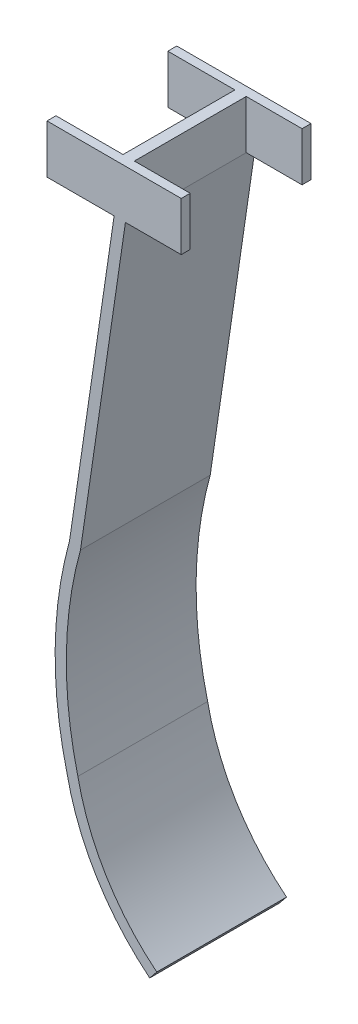
ISO-10303-21;
HEADER;
FILE_DESCRIPTION(('STEP AP214'),'2;1');
FILE_NAME('part.step','',(''),(''),'','','');
FILE_SCHEMA(('AUTOMOTIVE_DESIGN { 1 0 10303 214 1 1 1 1 }'));
ENDSEC;
DATA;
#1=APPLICATION_CONTEXT('core data for automotive mechanical design processes');
#2=APPLICATION_PROTOCOL_DEFINITION('international standard','automotive_design',2000,#1);
#3=PRODUCT_CONTEXT('',#1,'mechanical');
#4=PRODUCT('Part','Part','',(#3));
#5=PRODUCT_RELATED_PRODUCT_CATEGORY('part','',(#4));
#6=PRODUCT_DEFINITION_FORMATION('','',#4);
#7=PRODUCT_DEFINITION_CONTEXT('part definition',#1,'design');
#8=PRODUCT_DEFINITION('design','',#6,#7);
#9=PRODUCT_DEFINITION_SHAPE('','',#8);
#10=(LENGTH_UNIT() NAMED_UNIT(*) SI_UNIT(.MILLI.,.METRE.));
#11=(NAMED_UNIT(*) PLANE_ANGLE_UNIT() SI_UNIT($,.RADIAN.));
#12=(NAMED_UNIT(*) SI_UNIT($,.STERADIAN.) SOLID_ANGLE_UNIT());
#13=UNCERTAINTY_MEASURE_WITH_UNIT(LENGTH_MEASURE(1.E-05),#10,'distance_accuracy_value','');
#14=(GEOMETRIC_REPRESENTATION_CONTEXT(3) GLOBAL_UNCERTAINTY_ASSIGNED_CONTEXT((#13)) GLOBAL_UNIT_ASSIGNED_CONTEXT((#10,
#11,#12)) REPRESENTATION_CONTEXT('',''));
#15=CARTESIAN_POINT('',(0.,0.,0.));
#16=DIRECTION('',(0.,0.,1.));
#17=DIRECTION('',(1.,0.,0.));
#18=AXIS2_PLACEMENT_3D('',#15,#16,#17);
#19=CARTESIAN_POINT('',(0.,45.7887493873009,14.5));
#20=DIRECTION('',(0.,1.,0.));
#21=DIRECTION('',(0.,0.,1.));
#22=AXIS2_PLACEMENT_3D('',#19,#20,#21);
#23=PLANE('',#22);
#24=DIRECTION('',(0.,0.,-1.));
#25=VECTOR('',#24,1.);
#26=CARTESIAN_POINT('',(-30.3032531105134,45.7887493873009,14.5));
#27=LINE('',#26,#25);
#28=CARTESIAN_POINT('',(-30.3032531105134,45.7887493873009,1.));
#29=VERTEX_POINT('',#28);
#30=CARTESIAN_POINT('',(-30.3032531105134,45.7887493873009,0.));
#31=VERTEX_POINT('',#30);
#32=EDGE_CURVE('E198',#29,#31,#27,.T.);
#33=ORIENTED_EDGE('',*,*,#32,.F.);
#34=DIRECTION('',(1.,0.,0.));
#35=VECTOR('',#34,1.);
#36=CARTESIAN_POINT('',(-30.3032531105134,45.7887493873009,1.));
#37=LINE('',#36,#35);
#38=CARTESIAN_POINT('',(-36.5398548495292,45.7887493873009,0.999999999999999));
#39=VERTEX_POINT('',#38);
#40=EDGE_CURVE('E183',#39,#29,#37,.T.);
#41=ORIENTED_EDGE('',*,*,#40,.F.);
#42=DIRECTION('',(0.,0.,-1.));
#43=VECTOR('',#42,1.);
#44=CARTESIAN_POINT('',(-36.5398548495292,45.7887493873009,14.5));
#45=LINE('',#44,#43);
#46=CARTESIAN_POINT('',(-36.5398548495292,45.7887493873009,0.));
#47=VERTEX_POINT('',#46);
#48=EDGE_CURVE('E197',#39,#47,#45,.T.);
#49=ORIENTED_EDGE('',*,*,#48,.T.);
#50=DIRECTION('',(1.,0.,0.));
#51=VECTOR('',#50,1.);
#52=CARTESIAN_POINT('',(0.,45.7887493873009,0.));
#53=LINE('',#52,#51);
#54=EDGE_CURVE('E266',#47,#31,#53,.T.);
#55=ORIENTED_EDGE('',*,*,#54,.T.);
#56=EDGE_LOOP('',(#33,#41,#49,#55));
#57=FACE_BOUND('',#56,.T.);
#58=ADVANCED_FACE('F37',(#57),#23,.F.);
#59=CARTESIAN_POINT('',(-30.3032531105134,0.,14.5));
#60=DIRECTION('',(-1.,0.,0.));
#61=DIRECTION('',(0.,0.,1.));
#62=AXIS2_PLACEMENT_3D('',#59,#60,#61);
#63=PLANE('',#62);
#64=DIRECTION('',(0.,0.,-1.));
#65=VECTOR('',#64,1.);
#66=CARTESIAN_POINT('',(-30.3032531105134,51.2273312739926,14.5));
#67=LINE('',#66,#65);
#68=CARTESIAN_POINT('',(-30.3032531105134,51.2273312739926,1.));
#69=VERTEX_POINT('',#68);
#70=CARTESIAN_POINT('',(-30.3032531105134,51.2273312739926,0.));
#71=VERTEX_POINT('',#70);
#72=EDGE_CURVE('E242',#69,#71,#67,.T.);
#73=ORIENTED_EDGE('',*,*,#72,.F.);
#74=DIRECTION('',(0.,-1.,0.));
#75=VECTOR('',#74,1.);
#76=CARTESIAN_POINT('',(-30.3032531105134,60.2887493873009,1.));
#77=LINE('',#76,#75);
#78=EDGE_CURVE('E326',#69,#29,#77,.T.);
#79=ORIENTED_EDGE('',*,*,#78,.T.);
#80=ORIENTED_EDGE('',*,*,#32,.T.);
#81=DIRECTION('',(0.,1.,0.));
#82=VECTOR('',#81,1.);
#83=CARTESIAN_POINT('',(-30.3032531105134,0.,0.));
#84=LINE('',#83,#82);
#85=EDGE_CURVE('E264',#31,#71,#84,.T.);
#86=ORIENTED_EDGE('',*,*,#85,.T.);
#87=EDGE_LOOP('',(#73,#79,#80,#86));
#88=FACE_BOUND('',#87,.T.);
#89=ADVANCED_FACE('F349',(#88),#63,.F.);
#90=DIRECTION('',(0.,0.,-1.));
#91=VECTOR('',#90,1.);
#92=CARTESIAN_POINT('',(-45.3032531105134,45.7887493873009,14.5));
#93=LINE('',#92,#91);
#94=CARTESIAN_POINT('',(-45.3032531105134,45.7887493873009,14.5));
#95=VERTEX_POINT('',#94);
#96=CARTESIAN_POINT('',(-45.3032531105134,45.7887493873009,13.5));
#97=VERTEX_POINT('',#96);
#98=EDGE_CURVE('E252',#95,#97,#93,.T.);
#99=ORIENTED_EDGE('',*,*,#98,.T.);
#100=DIRECTION('',(-1.,0.,0.));
#101=VECTOR('',#100,1.);
#102=CARTESIAN_POINT('',(-45.3032531105134,45.7887493873009,13.5));
#103=LINE('',#102,#101);
#104=CARTESIAN_POINT('',(-37.8032531105133,45.7887493873009,13.5));
#105=VERTEX_POINT('',#104);
#106=EDGE_CURVE('E318',#105,#97,#103,.T.);
#107=ORIENTED_EDGE('',*,*,#106,.F.);
#108=DIRECTION('',(0.,0.,-1.));
#109=VECTOR('',#108,1.);
#110=CARTESIAN_POINT('',(-37.8032531105133,45.7887493873009,14.5));
#111=LINE('',#110,#109);
#112=CARTESIAN_POINT('',(-37.8032531105133,45.7887493873009,14.5));
#113=VERTEX_POINT('',#112);
#114=EDGE_CURVE('E221',#113,#105,#111,.T.);
#115=ORIENTED_EDGE('',*,*,#114,.F.);
#116=DIRECTION('',(1.,0.,0.));
#117=VECTOR('',#116,1.);
#118=CARTESIAN_POINT('',(0.,45.7887493873009,14.5));
#119=LINE('',#118,#117);
#120=EDGE_CURVE('E260',#95,#113,#119,.T.);
#121=ORIENTED_EDGE('',*,*,#120,.F.);
#122=EDGE_LOOP('',(#99,#107,#115,#121));
#123=FACE_BOUND('',#122,.T.);
#124=ADVANCED_FACE('F363',(#123),#23,.F.);
#125=CARTESIAN_POINT('',(-45.3032531105134,0.,14.5));
#126=DIRECTION('',(-1.,0.,0.));
#127=DIRECTION('',(0.,0.,1.));
#128=AXIS2_PLACEMENT_3D('',#125,#126,#127);
#129=PLANE('',#128);
#130=DIRECTION('',(0.,1.,0.));
#131=VECTOR('',#130,1.);
#132=CARTESIAN_POINT('',(-45.3032531105134,0.,13.5));
#133=LINE('',#132,#131);
#134=CARTESIAN_POINT('',(-45.3032531105134,51.2273312739926,13.5));
#135=VERTEX_POINT('',#134);
#136=EDGE_CURVE('E226',#97,#135,#133,.T.);
#137=ORIENTED_EDGE('',*,*,#136,.F.);
#138=ORIENTED_EDGE('',*,*,#98,.F.);
#139=DIRECTION('',(0.,1.,0.));
#140=VECTOR('',#139,1.);
#141=CARTESIAN_POINT('',(-45.3032531105134,0.,14.5));
#142=LINE('',#141,#140);
#143=CARTESIAN_POINT('',(-45.3032531105134,51.2273312739926,14.5));
#144=VERTEX_POINT('',#143);
#145=EDGE_CURVE('E289',#95,#144,#142,.T.);
#146=ORIENTED_EDGE('',*,*,#145,.T.);
#147=DIRECTION('',(0.,0.,-1.));
#148=VECTOR('',#147,1.);
#149=CARTESIAN_POINT('',(-45.3032531105134,51.2273312739926,14.5));
#150=LINE('',#149,#148);
#151=EDGE_CURVE('E243',#144,#135,#150,.T.);
#152=ORIENTED_EDGE('',*,*,#151,.T.);
#153=EDGE_LOOP('',(#137,#138,#146,#152));
#154=FACE_BOUND('',#153,.T.);
#155=ADVANCED_FACE('F370',(#154),#129,.T.);
#156=CARTESIAN_POINT('',(-37.8032531105133,45.7887493873009,1.));
#157=VERTEX_POINT('',#156);
#158=CARTESIAN_POINT('',(-37.8032531105133,45.7887493873009,0.));
#159=VERTEX_POINT('',#158);
#160=EDGE_CURVE('E220',#157,#159,#111,.T.);
#161=ORIENTED_EDGE('',*,*,#160,.F.);
#162=DIRECTION('',(1.,0.,0.));
#163=VECTOR('',#162,1.);
#164=CARTESIAN_POINT('',(-37.8032531105133,45.7887493873009,1.));
#165=LINE('',#164,#163);
#166=CARTESIAN_POINT('',(-45.3032531105134,45.7887493873009,1.));
#167=VERTEX_POINT('',#166);
#168=EDGE_CURVE('E324',#167,#157,#165,.T.);
#169=ORIENTED_EDGE('',*,*,#168,.F.);
#170=CARTESIAN_POINT('',(-45.3032531105134,45.7887493873009,0.));
#171=VERTEX_POINT('',#170);
#172=EDGE_CURVE('E256',#167,#171,#93,.T.);
#173=ORIENTED_EDGE('',*,*,#172,.T.);
#174=EDGE_CURVE('E285',#171,#159,#53,.T.);
#175=ORIENTED_EDGE('',*,*,#174,.T.);
#176=EDGE_LOOP('',(#161,#169,#173,#175));
#177=FACE_BOUND('',#176,.T.);
#178=ADVANCED_FACE('F372',(#177),#23,.F.);
#179=CARTESIAN_POINT('',(-43.5859632453595,6.3986964348674,14.5));
#180=DIRECTION('',(0.989395061400741,-0.145249483564743,0.));
#181=DIRECTION('',(0.145249483564743,0.989395061400741,0.));
#182=AXIS2_PLACEMENT_3D('',#179,#180,#181);
#183=PLANE('',#182);
#184=DIRECTION('',(-0.145249483564743,-0.989395061400741,0.));
#185=VECTOR('',#184,1.);
#186=CARTESIAN_POINT('',(-43.5859632453595,6.3986964348674,0.));
#187=LINE('',#186,#185);
#188=CARTESIAN_POINT('',(-42.789032240421,11.8271467206263,0.));
#189=VERTEX_POINT('',#188);
#190=EDGE_CURVE('E283',#159,#189,#187,.T.);
#191=ORIENTED_EDGE('',*,*,#190,.T.);
#192=DIRECTION('',(0.,0.,-1.));
#193=VECTOR('',#192,1.);
#194=CARTESIAN_POINT('',(-42.789032240421,11.8271467206263,14.5));
#195=LINE('',#194,#193);
#196=CARTESIAN_POINT('',(-42.789032240421,11.8271467206263,14.5));
#197=VERTEX_POINT('',#196);
#198=EDGE_CURVE('E217',#197,#189,#195,.T.);
#199=ORIENTED_EDGE('',*,*,#198,.F.);
#200=DIRECTION('',(-0.145249483564743,-0.989395061400741,0.));
#201=VECTOR('',#200,1.);
#202=CARTESIAN_POINT('',(-43.5859632453595,6.3986964348674,14.5));
#203=LINE('',#202,#201);
#204=EDGE_CURVE('E309',#113,#197,#203,.T.);
#205=ORIENTED_EDGE('',*,*,#204,.F.);
#206=ORIENTED_EDGE('',*,*,#114,.T.);
#207=DIRECTION('',(0.,0.,1.));
#208=VECTOR('',#207,1.);
#209=CARTESIAN_POINT('',(-37.8032531105133,45.7887493873009,13.5));
#210=LINE('',#209,#208);
#211=EDGE_CURVE('E321',#157,#105,#210,.T.);
#212=ORIENTED_EDGE('',*,*,#211,.F.);
#213=ORIENTED_EDGE('',*,*,#160,.T.);
#214=EDGE_LOOP('',(#191,#199,#205,#206,#212,#213));
#215=FACE_BOUND('',#214,.T.);
#216=ADVANCED_FACE('F39',(#215),#183,.F.);
#217=CARTESIAN_POINT('',(0.,0.,14.5));
#218=DIRECTION('',(0.,0.,-1.));
#219=DIRECTION('',(-1.,0.,0.));
#220=AXIS2_PLACEMENT_3D('',#217,#218,#219);
#221=CYLINDRICAL_SURFACE('',#220,44.3934981683468);
#222=CARTESIAN_POINT('',(0.,0.,0.));
#223=DIRECTION('',(0.,0.,1.));
#224=DIRECTION('',(1.,0.,0.));
#225=AXIS2_PLACEMENT_3D('',#222,#223,#224);
#226=CIRCLE('',#225,44.3934981683468);
#227=CARTESIAN_POINT('',(-43.0715853449332,-10.7527306065547,0.));
#228=VERTEX_POINT('',#227);
#229=EDGE_CURVE('E281',#189,#228,#226,.T.);
#230=ORIENTED_EDGE('',*,*,#229,.T.);
#231=DIRECTION('',(0.,0.,-1.));
#232=VECTOR('',#231,1.);
#233=CARTESIAN_POINT('',(-43.0715853449332,-10.7527306065547,14.5));
#234=LINE('',#233,#232);
#235=CARTESIAN_POINT('',(-43.0715853449332,-10.7527306065547,14.5));
#236=VERTEX_POINT('',#235);
#237=EDGE_CURVE('E214',#236,#228,#234,.T.);
#238=ORIENTED_EDGE('',*,*,#237,.F.);
#239=CARTESIAN_POINT('',(0.,0.,14.5));
#240=DIRECTION('',(0.,0.,1.));
#241=DIRECTION('',(1.,0.,0.));
#242=AXIS2_PLACEMENT_3D('',#239,#240,#241);
#243=CIRCLE('',#242,44.3934981683468);
#244=EDGE_CURVE('E307',#197,#236,#243,.T.);
#245=ORIENTED_EDGE('',*,*,#244,.F.);
#246=ORIENTED_EDGE('',*,*,#198,.T.);
#247=EDGE_LOOP('',(#230,#238,#245,#246));
#248=FACE_BOUND('',#247,.T.);
#249=ADVANCED_FACE('F385',(#248),#221,.T.);
#250=CARTESIAN_POINT('',(-17.1948167398782,-5.44561589008963,14.5));
#251=DIRECTION('',(0.,0.,-1.));
#252=DIRECTION('',(-1.,0.,0.));
#253=AXIS2_PLACEMENT_3D('',#250,#251,#252);
#254=CYLINDRICAL_SURFACE('',#253,26.4153860477806);
#255=CARTESIAN_POINT('',(-17.1948167398782,-5.44561589008963,0.));
#256=DIRECTION('',(0.,0.,1.));
#257=DIRECTION('',(1.,0.,0.));
#258=AXIS2_PLACEMENT_3D('',#255,#256,#257);
#259=CIRCLE('',#258,26.4153860477806);
#260=CARTESIAN_POINT('',(-33.8248277306005,-25.9691476159339,0.));
#261=VERTEX_POINT('',#260);
#262=EDGE_CURVE('E279',#228,#261,#259,.T.);
#263=ORIENTED_EDGE('',*,*,#262,.T.);
#264=DIRECTION('',(0.,0.,-1.));
#265=VECTOR('',#264,1.);
#266=CARTESIAN_POINT('',(-33.8248277306005,-25.9691476159339,14.5));
#267=LINE('',#266,#265);
#268=CARTESIAN_POINT('',(-33.8248277306005,-25.9691476159339,14.5));
#269=VERTEX_POINT('',#268);
#270=EDGE_CURVE('E211',#269,#261,#267,.T.);
#271=ORIENTED_EDGE('',*,*,#270,.F.);
#272=CARTESIAN_POINT('',(-17.1948167398782,-5.44561589008963,14.5));
#273=DIRECTION('',(0.,0.,1.));
#274=DIRECTION('',(1.,0.,0.));
#275=AXIS2_PLACEMENT_3D('',#272,#273,#274);
#276=CIRCLE('',#275,26.4153860477806);
#277=EDGE_CURVE('E305',#236,#269,#276,.T.);
#278=ORIENTED_EDGE('',*,*,#277,.F.);
#279=ORIENTED_EDGE('',*,*,#237,.T.);
#280=EDGE_LOOP('',(#263,#271,#278,#279));
#281=FACE_BOUND('',#280,.T.);
#282=ADVANCED_FACE('F423',(#281),#254,.T.);
#283=CARTESIAN_POINT('',(-7.71611877191605,6.25229330393928,14.5));
#284=DIRECTION('',(-0.776953692394313,0.629557749435938,0.));
#285=DIRECTION('',(-0.629557749435938,-0.776953692394313,0.));
#286=AXIS2_PLACEMENT_3D('',#283,#284,#285);
#287=PLANE('',#286);
#288=DIRECTION('',(0.629557749435938,0.776953692394313,0.));
#289=VECTOR('',#288,1.);
#290=CARTESIAN_POINT('',(-7.71611877191605,6.25229330393928,0.));
#291=LINE('',#290,#289);
#292=CARTESIAN_POINT('',(-33.0378805438056,-24.997955500441,0.));
#293=VERTEX_POINT('',#292);
#294=EDGE_CURVE('E276',#261,#293,#291,.T.);
#295=ORIENTED_EDGE('',*,*,#294,.T.);
#296=DIRECTION('',(0.,0.,-1.));
#297=VECTOR('',#296,1.);
#298=CARTESIAN_POINT('',(-33.0378805438056,-24.997955500441,14.5));
#299=LINE('',#298,#297);
#300=CARTESIAN_POINT('',(-33.0378805438056,-24.997955500441,14.5));
#301=VERTEX_POINT('',#300);
#302=EDGE_CURVE('E209',#301,#293,#299,.T.);
#303=ORIENTED_EDGE('',*,*,#302,.F.);
#304=DIRECTION('',(0.629557749435938,0.776953692394313,0.));
#305=VECTOR('',#304,1.);
#306=CARTESIAN_POINT('',(-7.71611877191605,6.25229330393928,14.5));
#307=LINE('',#306,#305);
#308=EDGE_CURVE('E303',#269,#301,#307,.T.);
#309=ORIENTED_EDGE('',*,*,#308,.F.);
#310=ORIENTED_EDGE('',*,*,#270,.T.);
#311=EDGE_LOOP('',(#295,#303,#309,#310));
#312=FACE_BOUND('',#311,.T.);
#313=ADVANCED_FACE('F418',(#312),#287,.F.);
#314=CARTESIAN_POINT('',(-17.1948167398782,-5.44561589008963,14.5));
#315=DIRECTION('',(0.,0.,-1.));
#316=DIRECTION('',(-1.,0.,0.));
#317=AXIS2_PLACEMENT_3D('',#314,#315,#316);
#318=CYLINDRICAL_SURFACE('',#317,25.1653860477806);
#319=CARTESIAN_POINT('',(-17.1948167398782,-5.44561589008963,0.));
#320=DIRECTION('',(0.,0.,1.));
#321=DIRECTION('',(1.,0.,0.));
#322=AXIS2_PLACEMENT_3D('',#319,#320,#321);
#323=CIRCLE('',#322,25.1653860477806);
#324=CARTESIAN_POINT('',(-41.852353206065,-10.4757799383589,0.));
#325=VERTEX_POINT('',#324);
#326=EDGE_CURVE('E273',#325,#293,#323,.T.);
#327=ORIENTED_EDGE('',*,*,#326,.F.);
#328=DIRECTION('',(0.,0.,-1.));
#329=VECTOR('',#328,1.);
#330=CARTESIAN_POINT('',(-41.852353206065,-10.4757799383589,14.5));
#331=LINE('',#330,#329);
#332=CARTESIAN_POINT('',(-41.852353206065,-10.4757799383589,14.5));
#333=VERTEX_POINT('',#332);
#334=EDGE_CURVE('E207',#333,#325,#331,.T.);
#335=ORIENTED_EDGE('',*,*,#334,.F.);
#336=CARTESIAN_POINT('',(-17.1948167398782,-5.44561589008963,14.5));
#337=DIRECTION('',(0.,0.,1.));
#338=DIRECTION('',(1.,0.,0.));
#339=AXIS2_PLACEMENT_3D('',#336,#337,#338);
#340=CIRCLE('',#339,25.1653860477806);
#341=EDGE_CURVE('E300',#333,#301,#340,.T.);
#342=ORIENTED_EDGE('',*,*,#341,.T.);
#343=ORIENTED_EDGE('',*,*,#302,.T.);
#344=EDGE_LOOP('',(#327,#335,#342,#343));
#345=FACE_BOUND('',#344,.T.);
#346=ADVANCED_FACE('F412',(#345),#318,.F.);
#347=CARTESIAN_POINT('',(0.,0.,14.5));
#348=DIRECTION('',(0.,0.,-1.));
#349=DIRECTION('',(-1.,0.,0.));
#350=AXIS2_PLACEMENT_3D('',#347,#348,#349);
#351=CYLINDRICAL_SURFACE('',#350,43.1434981683468);
#352=CARTESIAN_POINT('',(0.,0.,0.));
#353=DIRECTION('',(0.,0.,1.));
#354=DIRECTION('',(1.,0.,0.));
#355=AXIS2_PLACEMENT_3D('',#352,#353,#354);
#356=CIRCLE('',#355,43.1434981683468);
#357=CARTESIAN_POINT('',(-41.5636320249937,11.5683156549714,0.));
#358=VERTEX_POINT('',#357);
#359=EDGE_CURVE('E270',#358,#325,#356,.T.);
#360=ORIENTED_EDGE('',*,*,#359,.F.);
#361=DIRECTION('',(0.,0.,-1.));
#362=VECTOR('',#361,1.);
#363=CARTESIAN_POINT('',(-41.5636320249937,11.5683156549714,14.5));
#364=LINE('',#363,#362);
#365=CARTESIAN_POINT('',(-41.5636320249937,11.5683156549714,14.5));
#366=VERTEX_POINT('',#365);
#367=EDGE_CURVE('E205',#366,#358,#364,.T.);
#368=ORIENTED_EDGE('',*,*,#367,.F.);
#369=CARTESIAN_POINT('',(0.,0.,14.5));
#370=DIRECTION('',(0.,0.,1.));
#371=DIRECTION('',(1.,0.,0.));
#372=AXIS2_PLACEMENT_3D('',#369,#370,#371);
#373=CIRCLE('',#372,43.1434981683468);
#374=EDGE_CURVE('E297',#366,#333,#373,.T.);
#375=ORIENTED_EDGE('',*,*,#374,.T.);
#376=ORIENTED_EDGE('',*,*,#334,.T.);
#377=EDGE_LOOP('',(#360,#368,#375,#376));
#378=FACE_BOUND('',#377,.T.);
#379=ADVANCED_FACE('F378',(#378),#351,.F.);
#380=CARTESIAN_POINT('',(-42.3492194186086,6.21713458041147,14.5));
#381=DIRECTION('',(0.989395061400741,-0.145249483564743,0.));
#382=DIRECTION('',(0.145249483564743,0.989395061400741,0.));
#383=AXIS2_PLACEMENT_3D('',#380,#381,#382);
#384=PLANE('',#383);
#385=DIRECTION('',(-0.145249483564743,-0.989395061400741,0.));
#386=VECTOR('',#385,1.);
#387=CARTESIAN_POINT('',(-42.3492194186086,6.21713458041147,0.));
#388=LINE('',#387,#386);
#389=EDGE_CURVE('E267',#47,#358,#388,.T.);
#390=ORIENTED_EDGE('',*,*,#389,.F.);
#391=ORIENTED_EDGE('',*,*,#48,.F.);
#392=DIRECTION('',(0.,0.,-1.));
#393=VECTOR('',#392,1.);
#394=CARTESIAN_POINT('',(-36.5398548495292,45.7887493873009,0.999999999999999));
#395=LINE('',#394,#393);
#396=CARTESIAN_POINT('',(-36.5398548495292,45.7887493873009,13.5));
#397=VERTEX_POINT('',#396);
#398=EDGE_CURVE('E193',#397,#39,#395,.T.);
#399=ORIENTED_EDGE('',*,*,#398,.F.);
#400=CARTESIAN_POINT('',(-36.5398548495292,45.7887493873009,14.5));
#401=VERTEX_POINT('',#400);
#402=EDGE_CURVE('E192',#401,#397,#45,.T.);
#403=ORIENTED_EDGE('',*,*,#402,.F.);
#404=DIRECTION('',(-0.145249483564743,-0.989395061400741,0.));
#405=VECTOR('',#404,1.);
#406=CARTESIAN_POINT('',(-42.3492194186086,6.21713458041147,14.5));
#407=LINE('',#406,#405);
#408=EDGE_CURVE('E294',#401,#366,#407,.T.);
#409=ORIENTED_EDGE('',*,*,#408,.T.);
#410=ORIENTED_EDGE('',*,*,#367,.T.);
#411=EDGE_LOOP('',(#390,#391,#399,#403,#409,#410));
#412=FACE_BOUND('',#411,.T.);
#413=ADVANCED_FACE('F342',(#412),#384,.T.);
#414=ORIENTED_EDGE('',*,*,#402,.T.);
#415=DIRECTION('',(-1.,0.,0.));
#416=VECTOR('',#415,1.);
#417=CARTESIAN_POINT('',(-36.5398548495292,45.7887493873009,13.5));
#418=LINE('',#417,#416);
#419=CARTESIAN_POINT('',(-30.3032531105134,45.7887493873009,13.5));
#420=VERTEX_POINT('',#419);
#421=EDGE_CURVE('E175',#420,#397,#418,.T.);
#422=ORIENTED_EDGE('',*,*,#421,.F.);
#423=CARTESIAN_POINT('',(-30.3032531105134,45.7887493873009,14.5));
#424=VERTEX_POINT('',#423);
#425=EDGE_CURVE('E190',#424,#420,#27,.T.);
#426=ORIENTED_EDGE('',*,*,#425,.F.);
#427=EDGE_CURVE('E293',#401,#424,#119,.T.);
#428=ORIENTED_EDGE('',*,*,#427,.F.);
#429=EDGE_LOOP('',(#414,#422,#426,#428));
#430=FACE_BOUND('',#429,.T.);
#431=ADVANCED_FACE('F188',(#430),#23,.F.);
#432=ORIENTED_EDGE('',*,*,#425,.T.);
#433=DIRECTION('',(0.,-1.,0.));
#434=VECTOR('',#433,1.);
#435=CARTESIAN_POINT('',(-30.3032531105134,60.2887493873009,13.5));
#436=LINE('',#435,#434);
#437=CARTESIAN_POINT('',(-30.3032531105134,51.2273312739926,13.5));
#438=VERTEX_POINT('',#437);
#439=EDGE_CURVE('E172',#438,#420,#436,.T.);
#440=ORIENTED_EDGE('',*,*,#439,.F.);
#441=CARTESIAN_POINT('',(-30.3032531105134,51.2273312739926,14.5));
#442=VERTEX_POINT('',#441);
#443=EDGE_CURVE('E201',#442,#438,#67,.T.);
#444=ORIENTED_EDGE('',*,*,#443,.F.);
#445=DIRECTION('',(0.,1.,0.));
#446=VECTOR('',#445,1.);
#447=CARTESIAN_POINT('',(-30.3032531105134,0.,14.5));
#448=LINE('',#447,#446);
#449=EDGE_CURVE('E196',#424,#442,#448,.T.);
#450=ORIENTED_EDGE('',*,*,#449,.F.);
#451=EDGE_LOOP('',(#432,#440,#444,#450));
#452=FACE_BOUND('',#451,.T.);
#453=ADVANCED_FACE('F195',(#452),#63,.F.);
#454=CARTESIAN_POINT('',(0.,51.2273312739926,14.5));
#455=DIRECTION('',(0.,1.,0.));
#456=DIRECTION('',(0.,0.,1.));
#457=AXIS2_PLACEMENT_3D('',#454,#455,#456);
#458=PLANE('',#457);
#459=DIRECTION('',(-1.,0.,0.));
#460=VECTOR('',#459,1.);
#461=CARTESIAN_POINT('',(0.,51.2273312739926,1.));
#462=LINE('',#461,#460);
#463=CARTESIAN_POINT('',(-36.5398548495292,51.2273312739926,0.999999999999999));
#464=VERTEX_POINT('',#463);
#465=EDGE_CURVE('E11',#69,#464,#462,.T.);
#466=ORIENTED_EDGE('',*,*,#465,.F.);
#467=ORIENTED_EDGE('',*,*,#72,.T.);
#468=DIRECTION('',(1.,0.,0.));
#469=VECTOR('',#468,1.);
#470=CARTESIAN_POINT('',(0.,51.2273312739926,0.));
#471=LINE('',#470,#469);
#472=CARTESIAN_POINT('',(-45.3032531105134,51.2273312739926,0.));
#473=VERTEX_POINT('',#472);
#474=EDGE_CURVE('E261',#473,#71,#471,.T.);
#475=ORIENTED_EDGE('',*,*,#474,.F.);
#476=CARTESIAN_POINT('',(-45.3032531105134,51.2273312739926,1.));
#477=VERTEX_POINT('',#476);
#478=EDGE_CURVE('E248',#477,#473,#150,.T.);
#479=ORIENTED_EDGE('',*,*,#478,.F.);
#480=DIRECTION('',(-1.,0.,0.));
#481=VECTOR('',#480,1.);
#482=CARTESIAN_POINT('',(0.,51.2273312739926,1.00000000000001));
#483=LINE('',#482,#481);
#484=CARTESIAN_POINT('',(-37.8032531105133,51.2273312739926,1.));
#485=VERTEX_POINT('',#484);
#486=EDGE_CURVE('E60',#485,#477,#483,.T.);
#487=ORIENTED_EDGE('',*,*,#486,.F.);
#488=DIRECTION('',(0.,0.,-1.));
#489=VECTOR('',#488,1.);
#490=CARTESIAN_POINT('',(-37.8032531105133,51.2273312739926,14.5));
#491=LINE('',#490,#489);
#492=CARTESIAN_POINT('',(-37.8032531105133,51.2273312739926,13.5));
#493=VERTEX_POINT('',#492);
#494=EDGE_CURVE('E228',#493,#485,#491,.T.);
#495=ORIENTED_EDGE('',*,*,#494,.F.);
#496=DIRECTION('',(1.,0.,0.));
#497=VECTOR('',#496,1.);
#498=CARTESIAN_POINT('',(0.,51.2273312739926,13.5));
#499=LINE('',#498,#497);
#500=EDGE_CURVE('E288',#135,#493,#499,.T.);
#501=ORIENTED_EDGE('',*,*,#500,.F.);
#502=ORIENTED_EDGE('',*,*,#151,.F.);
#503=DIRECTION('',(1.,0.,0.));
#504=VECTOR('',#503,1.);
#505=CARTESIAN_POINT('',(0.,51.2273312739926,14.5));
#506=LINE('',#505,#504);
#507=EDGE_CURVE('E241',#144,#442,#506,.T.);
#508=ORIENTED_EDGE('',*,*,#507,.T.);
#509=ORIENTED_EDGE('',*,*,#443,.T.);
#510=DIRECTION('',(1.,0.,0.));
#511=VECTOR('',#510,1.);
#512=CARTESIAN_POINT('',(0.,51.2273312739926,13.5));
#513=LINE('',#512,#511);
#514=CARTESIAN_POINT('',(-36.5398548495292,51.2273312739926,13.5));
#515=VERTEX_POINT('',#514);
#516=EDGE_CURVE('E178',#515,#438,#513,.T.);
#517=ORIENTED_EDGE('',*,*,#516,.F.);
#518=DIRECTION('',(0.,0.,1.));
#519=VECTOR('',#518,1.);
#520=CARTESIAN_POINT('',(-36.5398548495292,51.2273312739926,14.5));
#521=LINE('',#520,#519);
#522=EDGE_CURVE('E45',#464,#515,#521,.T.);
#523=ORIENTED_EDGE('',*,*,#522,.F.);
#524=EDGE_LOOP('',(#466,#467,#475,#479,#487,#495,#501,#502,#508,#509,#517,#523));
#525=FACE_BOUND('',#524,.T.);
#526=ADVANCED_FACE('F238',(#525),#458,.T.);
#527=DIRECTION('',(0.,-1.,0.));
#528=VECTOR('',#527,1.);
#529=CARTESIAN_POINT('',(-45.3032531105134,0.,0.999999999999999));
#530=LINE('',#529,#528);
#531=EDGE_CURVE('E224',#477,#167,#530,.T.);
#532=ORIENTED_EDGE('',*,*,#531,.F.);
#533=ORIENTED_EDGE('',*,*,#478,.T.);
#534=DIRECTION('',(0.,1.,0.));
#535=VECTOR('',#534,1.);
#536=CARTESIAN_POINT('',(-45.3032531105134,0.,0.));
#537=LINE('',#536,#535);
#538=EDGE_CURVE('E257',#171,#473,#537,.T.);
#539=ORIENTED_EDGE('',*,*,#538,.F.);
#540=ORIENTED_EDGE('',*,*,#172,.F.);
#541=EDGE_LOOP('',(#532,#533,#539,#540));
#542=FACE_BOUND('',#541,.T.);
#543=ADVANCED_FACE('F388',(#542),#129,.T.);
#544=CARTESIAN_POINT('',(0.,0.,14.5));
#545=DIRECTION('',(0.,0.,1.));
#546=DIRECTION('',(1.,0.,0.));
#547=AXIS2_PLACEMENT_3D('',#544,#545,#546);
#548=PLANE('',#547);
#549=ORIENTED_EDGE('',*,*,#120,.T.);
#550=ORIENTED_EDGE('',*,*,#204,.T.);
#551=ORIENTED_EDGE('',*,*,#244,.T.);
#552=ORIENTED_EDGE('',*,*,#277,.T.);
#553=ORIENTED_EDGE('',*,*,#308,.T.);
#554=ORIENTED_EDGE('',*,*,#341,.F.);
#555=ORIENTED_EDGE('',*,*,#374,.F.);
#556=ORIENTED_EDGE('',*,*,#408,.F.);
#557=ORIENTED_EDGE('',*,*,#427,.T.);
#558=ORIENTED_EDGE('',*,*,#449,.T.);
#559=ORIENTED_EDGE('',*,*,#507,.F.);
#560=ORIENTED_EDGE('',*,*,#145,.F.);
#561=EDGE_LOOP('',(#549,#550,#551,#552,#553,#554,#555,#556,#557,#558,#559,#560));
#562=FACE_BOUND('',#561,.T.);
#563=ADVANCED_FACE('F405',(#562),#548,.T.);
#564=CARTESIAN_POINT('',(0.,0.,0.));
#565=DIRECTION('',(0.,0.,1.));
#566=DIRECTION('',(1.,0.,0.));
#567=AXIS2_PLACEMENT_3D('',#564,#565,#566);
#568=PLANE('',#567);
#569=ORIENTED_EDGE('',*,*,#174,.F.);
#570=ORIENTED_EDGE('',*,*,#538,.T.);
#571=ORIENTED_EDGE('',*,*,#474,.T.);
#572=ORIENTED_EDGE('',*,*,#85,.F.);
#573=ORIENTED_EDGE('',*,*,#54,.F.);
#574=ORIENTED_EDGE('',*,*,#389,.T.);
#575=ORIENTED_EDGE('',*,*,#359,.T.);
#576=ORIENTED_EDGE('',*,*,#326,.T.);
#577=ORIENTED_EDGE('',*,*,#294,.F.);
#578=ORIENTED_EDGE('',*,*,#262,.F.);
#579=ORIENTED_EDGE('',*,*,#229,.F.);
#580=ORIENTED_EDGE('',*,*,#190,.F.);
#581=EDGE_LOOP('',(#569,#570,#571,#572,#573,#574,#575,#576,#577,#578,#579,#580));
#582=FACE_BOUND('',#581,.T.);
#583=ADVANCED_FACE('F346',(#582),#568,.F.);
#584=CARTESIAN_POINT('',(-45.3032531105134,60.2887493873009,13.5));
#585=DIRECTION('',(0.,0.,1.));
#586=DIRECTION('',(1.,0.,0.));
#587=AXIS2_PLACEMENT_3D('',#584,#585,#586);
#588=PLANE('',#587);
#589=ORIENTED_EDGE('',*,*,#500,.T.);
#590=DIRECTION('',(0.,-1.,0.));
#591=VECTOR('',#590,1.);
#592=CARTESIAN_POINT('',(-37.8032531105133,60.2887493873009,13.5));
#593=LINE('',#592,#591);
#594=EDGE_CURVE('E315',#493,#105,#593,.T.);
#595=ORIENTED_EDGE('',*,*,#594,.T.);
#596=ORIENTED_EDGE('',*,*,#106,.T.);
#597=ORIENTED_EDGE('',*,*,#136,.T.);
#598=EDGE_LOOP('',(#589,#595,#596,#597));
#599=FACE_BOUND('',#598,.T.);
#600=ADVANCED_FACE('F401',(#599),#588,.F.);
#601=CARTESIAN_POINT('',(-37.8032531105133,60.2887493873009,13.5));
#602=DIRECTION('',(1.,0.,0.));
#603=DIRECTION('',(0.,0.,-1.));
#604=AXIS2_PLACEMENT_3D('',#601,#602,#603);
#605=PLANE('',#604);
#606=ORIENTED_EDGE('',*,*,#494,.T.);
#607=DIRECTION('',(0.,-1.,0.));
#608=VECTOR('',#607,1.);
#609=CARTESIAN_POINT('',(-37.8032531105133,60.2887493873009,1.));
#610=LINE('',#609,#608);
#611=EDGE_CURVE('E316',#485,#157,#610,.T.);
#612=ORIENTED_EDGE('',*,*,#611,.T.);
#613=ORIENTED_EDGE('',*,*,#211,.T.);
#614=ORIENTED_EDGE('',*,*,#594,.F.);
#615=EDGE_LOOP('',(#606,#612,#613,#614));
#616=FACE_BOUND('',#615,.T.);
#617=ADVANCED_FACE('F359',(#616),#605,.F.);
#618=CARTESIAN_POINT('',(-37.8032531105133,60.2887493873009,1.));
#619=DIRECTION('',(0.,0.,-1.));
#620=DIRECTION('',(-1.,0.,0.));
#621=AXIS2_PLACEMENT_3D('',#618,#619,#620);
#622=PLANE('',#621);
#623=ORIENTED_EDGE('',*,*,#486,.T.);
#624=ORIENTED_EDGE('',*,*,#531,.T.);
#625=ORIENTED_EDGE('',*,*,#168,.T.);
#626=ORIENTED_EDGE('',*,*,#611,.F.);
#627=EDGE_LOOP('',(#623,#624,#625,#626));
#628=FACE_BOUND('',#627,.T.);
#629=ADVANCED_FACE('F352',(#628),#622,.F.);
#630=CARTESIAN_POINT('',(-30.3032531105134,60.2887493873009,1.));
#631=DIRECTION('',(0.,0.,-1.));
#632=DIRECTION('',(-1.,0.,0.));
#633=AXIS2_PLACEMENT_3D('',#630,#631,#632);
#634=PLANE('',#633);
#635=ORIENTED_EDGE('',*,*,#465,.T.);
#636=DIRECTION('',(0.,-1.,0.));
#637=VECTOR('',#636,1.);
#638=CARTESIAN_POINT('',(-36.5398548495292,60.2887493873009,0.999999999999999));
#639=LINE('',#638,#637);
#640=EDGE_CURVE('E235',#464,#39,#639,.T.);
#641=ORIENTED_EDGE('',*,*,#640,.T.);
#642=ORIENTED_EDGE('',*,*,#40,.T.);
#643=ORIENTED_EDGE('',*,*,#78,.F.);
#644=EDGE_LOOP('',(#635,#641,#642,#643));
#645=FACE_BOUND('',#644,.T.);
#646=ADVANCED_FACE('F350',(#645),#634,.F.);
#647=CARTESIAN_POINT('',(-36.5398548495292,60.2887493873009,0.999999999999999));
#648=DIRECTION('',(-1.,0.,0.));
#649=DIRECTION('',(0.,0.,1.));
#650=AXIS2_PLACEMENT_3D('',#647,#648,#649);
#651=PLANE('',#650);
#652=ORIENTED_EDGE('',*,*,#522,.T.);
#653=DIRECTION('',(0.,-1.,0.));
#654=VECTOR('',#653,1.);
#655=CARTESIAN_POINT('',(-36.5398548495292,60.2887493873009,13.5));
#656=LINE('',#655,#654);
#657=EDGE_CURVE('E52',#515,#397,#656,.T.);
#658=ORIENTED_EDGE('',*,*,#657,.T.);
#659=ORIENTED_EDGE('',*,*,#398,.T.);
#660=ORIENTED_EDGE('',*,*,#640,.F.);
#661=EDGE_LOOP('',(#652,#658,#659,#660));
#662=FACE_BOUND('',#661,.T.);
#663=ADVANCED_FACE('F233',(#662),#651,.F.);
#664=CARTESIAN_POINT('',(-36.5398548495292,60.2887493873009,13.5));
#665=DIRECTION('',(0.,0.,1.));
#666=DIRECTION('',(1.,0.,0.));
#667=AXIS2_PLACEMENT_3D('',#664,#665,#666);
#668=PLANE('',#667);
#669=ORIENTED_EDGE('',*,*,#516,.T.);
#670=ORIENTED_EDGE('',*,*,#439,.T.);
#671=ORIENTED_EDGE('',*,*,#421,.T.);
#672=ORIENTED_EDGE('',*,*,#657,.F.);
#673=EDGE_LOOP('',(#669,#670,#671,#672));
#674=FACE_BOUND('',#673,.T.);
#675=ADVANCED_FACE('F174',(#674),#668,.F.);
#676=CLOSED_SHELL('',(#58,#89,#124,#155,#178,#216,#249,#282,#313,#346,#379,#413,#431,#453,#526,
#543,#563,#583,#600,#617,#629,#646,#663,#675));
#677=MANIFOLD_SOLID_BREP('B2',#676);
#678=ADVANCED_BREP_SHAPE_REPRESENTATION('',(#18,#677),#14);
#679=SHAPE_DEFINITION_REPRESENTATION(#9,#678);
ENDSEC;
END-ISO-10303-21;
